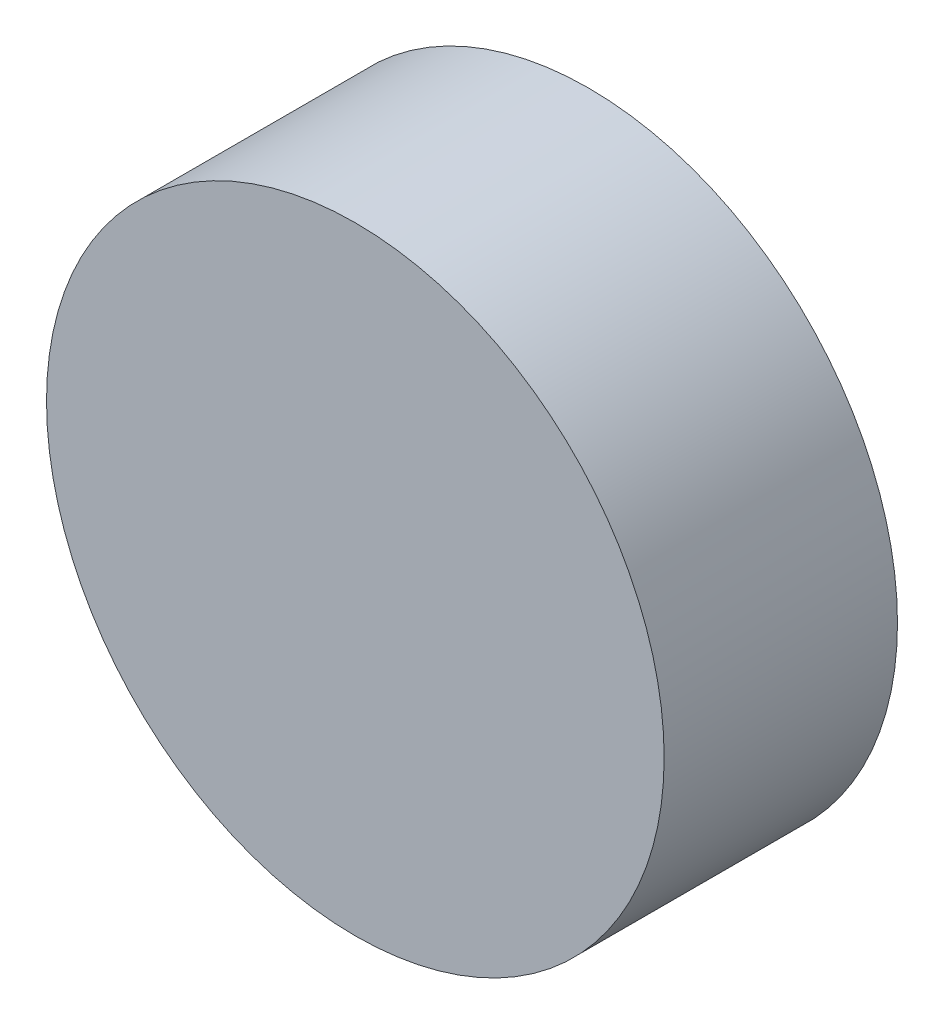
ISO-10303-21;
HEADER;
FILE_DESCRIPTION(('STEP AP214'),'2;1');
FILE_NAME('part.step','',(''),(''),'','','');
FILE_SCHEMA(('AUTOMOTIVE_DESIGN { 1 0 10303 214 1 1 1 1 }'));
ENDSEC;
DATA;
#1=APPLICATION_CONTEXT('core data for automotive mechanical design processes');
#2=APPLICATION_PROTOCOL_DEFINITION('international standard','automotive_design',2000,#1);
#3=PRODUCT_CONTEXT('',#1,'mechanical');
#4=PRODUCT('Part','Part','',(#3));
#5=PRODUCT_RELATED_PRODUCT_CATEGORY('part','',(#4));
#6=PRODUCT_DEFINITION_FORMATION('','',#4);
#7=PRODUCT_DEFINITION_CONTEXT('part definition',#1,'design');
#8=PRODUCT_DEFINITION('design','',#6,#7);
#9=PRODUCT_DEFINITION_SHAPE('','',#8);
#10=(LENGTH_UNIT() NAMED_UNIT(*) SI_UNIT(.MILLI.,.METRE.));
#11=(NAMED_UNIT(*) PLANE_ANGLE_UNIT() SI_UNIT($,.RADIAN.));
#12=(NAMED_UNIT(*) SI_UNIT($,.STERADIAN.) SOLID_ANGLE_UNIT());
#13=UNCERTAINTY_MEASURE_WITH_UNIT(LENGTH_MEASURE(1.E-05),#10,'distance_accuracy_value','');
#14=(GEOMETRIC_REPRESENTATION_CONTEXT(3) GLOBAL_UNCERTAINTY_ASSIGNED_CONTEXT((#13)) GLOBAL_UNIT_ASSIGNED_CONTEXT((#10,
#11,#12)) REPRESENTATION_CONTEXT('',''));
#15=CARTESIAN_POINT('',(0.,0.,0.));
#16=DIRECTION('',(0.,0.,1.));
#17=DIRECTION('',(1.,0.,0.));
#18=AXIS2_PLACEMENT_3D('',#15,#16,#17);
#19=CARTESIAN_POINT('',(0.,0.,0.85));
#20=DIRECTION('',(0.,0.,-1.));
#21=DIRECTION('',(-1.,0.,0.));
#22=AXIS2_PLACEMENT_3D('',#19,#20,#21);
#23=CYLINDRICAL_SURFACE('',#22,2.25);
#24=CARTESIAN_POINT('',(0.,0.,0.85));
#25=DIRECTION('',(0.,0.,1.));
#26=DIRECTION('',(1.,0.,0.));
#27=AXIS2_PLACEMENT_3D('',#24,#25,#26);
#28=CIRCLE('',#27,2.25);
#29=CARTESIAN_POINT('',(2.25,0.,0.85));
#30=VERTEX_POINT('',#29);
#31=EDGE_CURVE('E10',#30,#30,#28,.T.);
#32=ORIENTED_EDGE('',*,*,#31,.F.);
#33=EDGE_LOOP('',(#32));
#34=FACE_BOUND('',#33,.T.);
#35=CARTESIAN_POINT('',(0.,0.,-0.85));
#36=DIRECTION('',(0.,0.,1.));
#37=DIRECTION('',(1.,0.,0.));
#38=AXIS2_PLACEMENT_3D('',#35,#36,#37);
#39=CIRCLE('',#38,2.25);
#40=CARTESIAN_POINT('',(2.25,0.,-0.85));
#41=VERTEX_POINT('',#40);
#42=EDGE_CURVE('E34',#41,#41,#39,.T.);
#43=ORIENTED_EDGE('',*,*,#42,.T.);
#44=EDGE_LOOP('',(#43));
#45=FACE_BOUND('',#44,.T.);
#46=ADVANCED_FACE('F31',(#34,#45),#23,.T.);
#47=CARTESIAN_POINT('',(0.,0.,0.85));
#48=DIRECTION('',(0.,0.,1.));
#49=DIRECTION('',(1.,0.,0.));
#50=AXIS2_PLACEMENT_3D('',#47,#48,#49);
#51=PLANE('',#50);
#52=ORIENTED_EDGE('',*,*,#31,.T.);
#53=EDGE_LOOP('',(#52));
#54=FACE_BOUND('',#53,.T.);
#55=ADVANCED_FACE('F46',(#54),#51,.T.);
#56=CARTESIAN_POINT('',(0.,0.,-0.85));
#57=DIRECTION('',(0.,0.,1.));
#58=DIRECTION('',(1.,0.,0.));
#59=AXIS2_PLACEMENT_3D('',#56,#57,#58);
#60=PLANE('',#59);
#61=ORIENTED_EDGE('',*,*,#42,.F.);
#62=EDGE_LOOP('',(#61));
#63=FACE_BOUND('',#62,.T.);
#64=ADVANCED_FACE('F44',(#63),#60,.F.);
#65=CLOSED_SHELL('',(#46,#55,#64));
#66=MANIFOLD_SOLID_BREP('B2',#65);
#67=ADVANCED_BREP_SHAPE_REPRESENTATION('',(#18,#66),#14);
#68=SHAPE_DEFINITION_REPRESENTATION(#9,#67);
ENDSEC;
END-ISO-10303-21;
